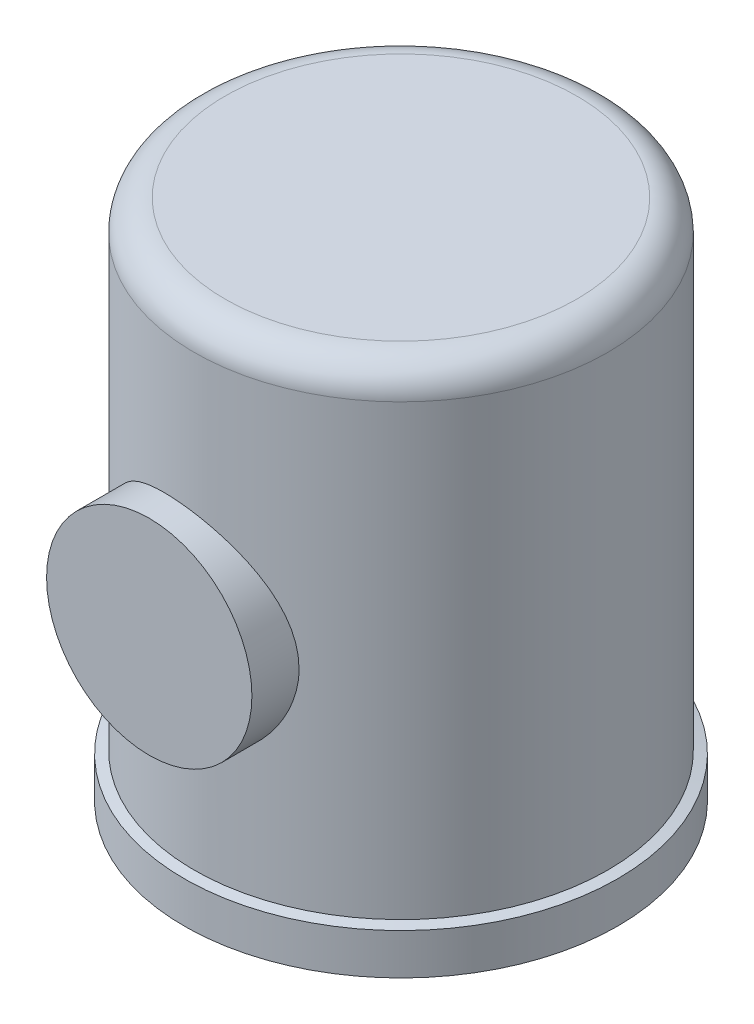
ISO-10303-21;
HEADER;
FILE_DESCRIPTION(('STEP AP214'),'2;1');
FILE_NAME('part.step','',(''),(''),'','','');
FILE_SCHEMA(('AUTOMOTIVE_DESIGN { 1 0 10303 214 1 1 1 1 }'));
ENDSEC;
DATA;
#1=APPLICATION_CONTEXT('core data for automotive mechanical design processes');
#2=APPLICATION_PROTOCOL_DEFINITION('international standard','automotive_design',2000,#1);
#3=PRODUCT_CONTEXT('',#1,'mechanical');
#4=PRODUCT('Part','Part','',(#3));
#5=PRODUCT_RELATED_PRODUCT_CATEGORY('part','',(#4));
#6=PRODUCT_DEFINITION_FORMATION('','',#4);
#7=PRODUCT_DEFINITION_CONTEXT('part definition',#1,'design');
#8=PRODUCT_DEFINITION('design','',#6,#7);
#9=PRODUCT_DEFINITION_SHAPE('','',#8);
#10=(LENGTH_UNIT() NAMED_UNIT(*) SI_UNIT(.MILLI.,.METRE.));
#11=(NAMED_UNIT(*) PLANE_ANGLE_UNIT() SI_UNIT($,.RADIAN.));
#12=(NAMED_UNIT(*) SI_UNIT($,.STERADIAN.) SOLID_ANGLE_UNIT());
#13=UNCERTAINTY_MEASURE_WITH_UNIT(LENGTH_MEASURE(1.E-05),#10,'distance_accuracy_value','');
#14=(GEOMETRIC_REPRESENTATION_CONTEXT(3) GLOBAL_UNCERTAINTY_ASSIGNED_CONTEXT((#13)) GLOBAL_UNIT_ASSIGNED_CONTEXT((#10,
#11,#12)) REPRESENTATION_CONTEXT('',''));
#15=CARTESIAN_POINT('',(0.,0.,0.));
#16=DIRECTION('',(0.,0.,1.));
#17=DIRECTION('',(1.,0.,0.));
#18=AXIS2_PLACEMENT_3D('',#15,#16,#17);
#19=CARTESIAN_POINT('',(2.76491495539491,4.729999792516,0.));
#20=DIRECTION('',(0.,-1.,0.));
#21=DIRECTION('',(1.,0.,0.));
#22=AXIS2_PLACEMENT_3D('',#19,#20,#21);
#23=CYLINDRICAL_SURFACE('',#22,20.1350850446053);
#24=CARTESIAN_POINT('',(-8.18093584541035,20.8897612006018,16.9000000000001));
#25=CARTESIAN_POINT('',(-8.07530784233286,20.6169076546923,16.9684093910414));
#26=CARTESIAN_POINT('',(-7.95826143011212,20.350136155145,17.0428199522178));
#27=CARTESIAN_POINT('',(-7.70277620277622,19.8301799099455,17.2009200857928));
#28=CARTESIAN_POINT('',(-7.56435459368962,19.5769844551371,17.2846021798704));
#29=CARTESIAN_POINT('',(-7.26758846568886,19.0854909306585,17.4585237677568));
#30=CARTESIAN_POINT('',(-7.10927083661877,18.8471733919518,17.5487543429049));
#31=CARTESIAN_POINT('',(-6.77367900963651,18.3859392774143,17.7334023530996));
#32=CARTESIAN_POINT('',(-6.59640063509786,18.1630261126956,17.8278207079281));
#33=CARTESIAN_POINT('',(-6.22445343230987,17.7341321481467,18.0182250556329));
#34=CARTESIAN_POINT('',(-6.02983334221243,17.5281068348404,18.1142060718637));
#35=CARTESIAN_POINT('',(-5.62373445109772,17.1332195626569,18.305808238361));
#36=CARTESIAN_POINT('',(-5.4122557707432,16.9443574809572,18.4014293911981));
#37=CARTESIAN_POINT('',(-4.97315901226983,16.5846171466273,18.5903478760803));
#38=CARTESIAN_POINT('',(-4.74552562923659,16.4137563395148,18.6836428881781));
#39=CARTESIAN_POINT('',(-4.27542191651222,16.091419883849,18.8658108287844));
#40=CARTESIAN_POINT('',(-4.03295886162668,15.9399348413408,18.9546858873475));
#41=CARTESIAN_POINT('',(-3.52500708425442,15.6522434096232,19.1293828609319));
#42=CARTESIAN_POINT('',(-3.25899829818441,15.5168099524001,19.2149700528718));
#43=CARTESIAN_POINT('',(-2.71369410908991,15.2694549310798,19.3774978564945));
#44=CARTESIAN_POINT('',(-2.43439825055208,15.1575341737688,19.4544381714367));
#45=CARTESIAN_POINT('',(-1.86468914673446,14.9587775680229,19.5978214771267));
#46=CARTESIAN_POINT('',(-1.57428627312857,14.8719189345674,19.6642739777197));
#47=CARTESIAN_POINT('',(-0.984444075586677,14.7245506594596,19.7852100741211));
#48=CARTESIAN_POINT('',(-0.685006039035176,14.6640372827567,19.8396953660154));
#49=CARTESIAN_POINT('',(-0.110844222114393,14.5753180410868,19.9305617125401));
#50=CARTESIAN_POINT('',(0.163265120079265,14.5444355142884,19.9682263325918));
#51=CARTESIAN_POINT('',(0.714403215252783,14.5054414349707,20.0323235597978));
#52=CARTESIAN_POINT('',(0.991431763668969,14.497328297396,20.0587569486879));
#53=CARTESIAN_POINT('',(1.54595603999393,14.5042109496734,20.1000763169285));
#54=CARTESIAN_POINT('',(1.82345154690142,14.5191978412573,20.1149667393778));
#55=CARTESIAN_POINT('',(2.37659756904154,14.5722893081941,20.1332416934574));
#56=CARTESIAN_POINT('',(2.65224817179721,14.6103927789138,20.1366267748231));
#57=CARTESIAN_POINT('',(3.17574869936583,14.70514867627,20.1324462641042));
#58=CARTESIAN_POINT('',(3.42394912430404,14.7599219743194,20.125798263234));
#59=CARTESIAN_POINT('',(3.9150994736953,14.8880850435606,20.1037098962858));
#60=CARTESIAN_POINT('',(4.15804929965174,14.9614751636592,20.0882693654159));
#61=CARTESIAN_POINT('',(4.63707989909872,15.1262626118931,20.0492993154275));
#62=CARTESIAN_POINT('',(4.87316078776599,15.2176596378928,20.0257699320258));
#63=CARTESIAN_POINT('',(5.33702153328384,15.4177280521712,19.9714912283489));
#64=CARTESIAN_POINT('',(5.56480103876024,15.5264001706144,19.9407416028704));
#65=CARTESIAN_POINT('',(6.01640737096427,15.7631585793609,19.8721639531533));
#66=CARTESIAN_POINT('',(6.23998988997428,15.8916651418116,19.8341770621977));
#67=CARTESIAN_POINT('',(6.67591347683623,16.1650634787058,19.7528475540714));
#68=CARTESIAN_POINT('',(6.88825073569199,16.3099607535542,19.7095031385646));
#69=CARTESIAN_POINT('',(7.5067314007074,16.7678213431288,19.5733154917595));
#70=CARTESIAN_POINT('',(7.89457640948268,17.1040760910856,19.4742803821297));
#71=CARTESIAN_POINT('',(8.64428188968364,17.8620070022761,19.2618649165235));
#72=CARTESIAN_POINT('',(9.00112955278611,18.2885151422152,19.1479807959494));
#73=CARTESIAN_POINT('',(9.48022032439611,18.9687162429615,18.9830176280469));
#74=CARTESIAN_POINT('',(9.63062258020748,19.2023326102863,18.9289783210431));
#75=CARTESIAN_POINT('',(9.91183912913681,19.6819854346959,18.8246009674059));
#76=CARTESIAN_POINT('',(10.0426511834992,19.9280233070127,18.7742633441326));
#77=CARTESIAN_POINT('',(10.287103702945,20.4382868555187,18.6776903444702));
#78=CARTESIAN_POINT('',(10.4001401558616,20.702832424011,18.6316151396441));
#79=CARTESIAN_POINT('',(10.6032760222318,21.2416485703971,18.5470713225928));
#80=CARTESIAN_POINT('',(10.6933857336615,21.5159147188162,18.5085992969969));
#81=CARTESIAN_POINT('',(10.8497288780311,22.0721473486626,18.4408433522351));
#82=CARTESIAN_POINT('',(10.9159739432483,22.354110006305,18.4115549576225));
#83=CARTESIAN_POINT('',(11.0238430459656,22.9235789677835,18.363421903234));
#84=CARTESIAN_POINT('',(11.0654694413303,23.211084738001,18.3445762433112));
#85=CARTESIAN_POINT('',(11.1213643814997,23.7672760771221,18.3191773524844));
#86=CARTESIAN_POINT('',(11.137462964881,24.0357416112366,18.3118026604497));
#87=CARTESIAN_POINT('',(11.1479728364524,24.5731797629995,18.3069940191555));
#88=CARTESIAN_POINT('',(11.1423852361568,24.8421523539526,18.3095595604144));
#89=CARTESIAN_POINT('',(11.1095914694858,25.3784749096081,18.3245284668051));
#90=CARTESIAN_POINT('',(11.0823868898984,25.6458249919588,18.3369311098472));
#91=CARTESIAN_POINT('',(11.0066797437461,26.1768770017012,18.3710827043385));
#92=CARTESIAN_POINT('',(10.9581772328426,26.4405789386253,18.3928316313615));
#93=CARTESIAN_POINT('',(10.8429576922543,26.9511020545741,18.4437159901738));
#94=CARTESIAN_POINT('',(10.7771230980251,27.1981590077301,18.4724896473537));
#95=CARTESIAN_POINT('',(10.6270450476799,27.6857407426478,18.5368603145595));
#96=CARTESIAN_POINT('',(10.5427952381667,27.9262632376902,18.5724596789875));
#97=CARTESIAN_POINT('',(10.2634458122365,28.6358576456998,18.6878174044232));
#98=CARTESIAN_POINT('',(10.041669199114,29.093293954474,18.7761715199073));
#99=CARTESIAN_POINT('',(9.51535226985977,29.9975748085056,18.9720043918094));
#100=CARTESIAN_POINT('',(9.20616118802674,30.441516389122,19.0803815557358));
#101=CARTESIAN_POINT('',(8.69231563663447,31.0654602756239,19.2437000769331));
#102=CARTESIAN_POINT('',(8.51256990551251,31.2665529473097,19.2982974476691));
#103=CARTESIAN_POINT('',(8.13715914614069,31.6538249506679,19.4061524528647));
#104=CARTESIAN_POINT('',(7.94149196700701,31.8400022606076,19.4594099050335));
#105=CARTESIAN_POINT('',(7.52275238407479,32.2072586159779,19.5661480759746));
#106=CARTESIAN_POINT('',(7.29873401032303,32.3873147633267,19.6194399203278));
#107=CARTESIAN_POINT('',(6.83533491055874,32.727910808636,19.7207897446565));
#108=CARTESIAN_POINT('',(6.59596036410024,32.8884584827543,19.7688498092402));
#109=CARTESIAN_POINT('',(6.10329517828921,33.1887774521509,19.8579837152425));
#110=CARTESIAN_POINT('',(5.85000590601641,33.3285507834635,19.8990582413508));
#111=CARTESIAN_POINT('',(5.33125027614361,33.5860354267319,19.9725855687246));
#112=CARTESIAN_POINT('',(5.06578482471519,33.7037483771527,20.0050390103685));
#113=CARTESIAN_POINT('',(4.53766260527249,33.9108386839948,20.0585655256708));
#114=CARTESIAN_POINT('',(4.27547969502705,34.0013027108354,20.0801090040033));
#115=CARTESIAN_POINT('',(3.74390456456065,34.1602648885666,20.1130336718265));
#116=CARTESIAN_POINT('',(3.47451254141546,34.2287636392595,20.1244151388247));
#117=CARTESIAN_POINT('',(2.9308569408376,34.3430947425977,20.1362359941121));
#118=CARTESIAN_POINT('',(2.65659582072991,34.3889382098955,20.1366807531685));
#119=CARTESIAN_POINT('',(2.10542963420214,34.4576088365553,20.1261690631826));
#120=CARTESIAN_POINT('',(1.82852473075143,34.4804374054835,20.1152133124574));
#121=CARTESIAN_POINT('',(1.2965308403308,34.5021031805338,20.0830968687472));
#122=CARTESIAN_POINT('',(1.04145817367567,34.5027039469037,20.0628170222538));
#123=CARTESIAN_POINT('',(0.532973081523891,34.4845174771381,20.0126295815022));
#124=CARTESIAN_POINT('',(0.279560552746959,34.465731458842,19.9827225920831));
#125=CARTESIAN_POINT('',(-0.223837850706678,34.4091600469359,19.9136525476325));
#126=CARTESIAN_POINT('',(-0.473823852705735,34.3713753612523,19.8744898375156));
#127=CARTESIAN_POINT('',(-0.968763357056348,34.2773731593252,19.7874818546674));
#128=CARTESIAN_POINT('',(-1.21371670506459,34.2211550786535,19.7396363160892));
#129=CARTESIAN_POINT('',(-1.6990953515102,34.0904593886224,19.6355893942516));
#130=CARTESIAN_POINT('',(-1.93946779416698,34.0158373467637,19.5793233721991));
#131=CARTESIAN_POINT('',(-2.41240783553319,33.8493507296399,19.4596122516007));
#132=CARTESIAN_POINT('',(-2.64497263329956,33.7574800428295,19.3961646116357));
#133=CARTESIAN_POINT('',(-3.1011318815468,33.5573478697704,19.2631150228216));
#134=CARTESIAN_POINT('',(-3.32472538274953,33.4490846547378,19.1935124251826));
#135=CARTESIAN_POINT('',(-3.76207666808375,33.2169693901737,19.0492280228991));
#136=CARTESIAN_POINT('',(-3.97583003993785,33.0931104387812,18.9745439762374));
#137=CARTESIAN_POINT('',(-4.41359772014838,32.8174261308166,18.8135674099701));
#138=CARTESIAN_POINT('',(-4.63647934408464,32.6640406957654,18.7268630822426));
#139=CARTESIAN_POINT('',(-5.0683418152653,32.3403969277554,18.5503686522877));
#140=CARTESIAN_POINT('',(-5.27732128923421,32.1701369320257,18.4605782465376));
#141=CARTESIAN_POINT('',(-5.68050942211954,31.8136741613233,18.2796401284087));
#142=CARTESIAN_POINT('',(-5.87472164377145,31.6274752549516,18.1884927497984));
#143=CARTESIAN_POINT('',(-6.24758052401086,31.2400004958486,18.0066565399016));
#144=CARTESIAN_POINT('',(-6.42622646229572,31.0387239462262,17.9159677300173));
#145=CARTESIAN_POINT('',(-6.92632667036771,30.4270873254079,17.6533175279046));
#146=CARTESIAN_POINT('',(-7.2256995395081,29.9966973384719,17.484385773061));
#147=CARTESIAN_POINT('',(-7.6235692279401,29.3154048222201,17.2489147025606));
#148=CARTESIAN_POINT('',(-7.74773632737728,29.0821636125389,17.1733611010828));
#149=CARTESIAN_POINT('',(-7.97808430959972,28.604428312115,17.030204774891));
#150=CARTESIAN_POINT('',(-8.08425292224474,28.3599266880475,16.9626074837679));
#151=CARTESIAN_POINT('',(-8.18093584541043,28.1102387993979,16.9000000000001));
#152=B_SPLINE_CURVE_WITH_KNOTS('',3,(#24,#25,#26,#27,#28,#29,#30,#31,#32,#33,#34,#35,#36,#37,
#38,#39,#40,#41,#42,#43,#44,#45,#46,#47,#48,#49,#50,#51,#52,#53,#54,#55,#56,#57,#58,#59,#60,#61,
#62,#63,#64,#65,#66,#67,#68,#69,#70,#71,#72,#73,#74,#75,#76,#77,#78,#79,#80,#81,#82,#83,#84,#85,
#86,#87,#88,#89,#90,#91,#92,#93,#94,#95,#96,#97,#98,#99,#100,#101,#102,#103,#104,#105,#106,#107,
#108,#109,#110,#111,#112,#113,#114,#115,#116,#117,#118,#119,#120,#121,#122,#123,#124,#125,#126,
#127,#128,#129,#130,#131,#132,#133,#134,#135,#136,#137,#138,#139,#140,#141,#142,#143,#144,#145,
#146,#147,#148,#149,#150,#151),.UNSPECIFIED.,.F.,.F.,(4,2,2,2,2,2,2,2,2,2,2,2,2,2,2,2,2,2,2,2,2,
2,2,2,2,2,2,2,2,2,2,2,2,2,2,2,2,2,2,2,2,2,2,2,2,2,2,2,2,2,2,2,2,2,2,2,2,2,2,2,2,2,2,4),(0.,
0.900888498876488,1.80105556905184,2.70001887297264,3.59918060775548,4.49589052201921,
5.39259401879715,6.29015869240044,7.18728653662181,8.11761619816098,9.04797777669219,
9.97749084029523,10.9068720809396,11.7409492186726,12.5749682919875,13.4086661764895,
14.2423242256072,15.0042177811006,15.7661256166601,16.5280206693552,17.2899479335577,
18.07107828833,18.8524715573122,20.4144697231856,22.1092707391239,22.9576264775194,
23.8060790916005,24.6790004330854,25.5515289906236,26.4236316767437,27.2956508232904,
28.1017579523488,28.9078237653464,29.7138304147839,30.5198349577621,31.2908384908395,
32.062108447371,33.6036162038828,35.2513683003423,36.0762172270674,36.9011777710987,
37.7770259965441,38.6525239520059,39.5279360457367,40.4032830952125,41.2367278403115,
42.0701498247292,42.9031625264938,43.7361242066156,44.5028437851302,45.2695152027735,
46.0361580549072,46.8028243837397,47.575710378643,48.3488707413409,49.122112699715,
49.8956980654193,50.7471456412593,51.5986771998748,52.4500026624917,53.3013674978147,
54.9462160703816,55.7699036595337,56.5941505440372),.UNSPECIFIED.);
#153=CARTESIAN_POINT('',(-8.18093584541035,20.8897612006018,16.9000000000001));
#154=VERTEX_POINT('',#153);
#155=CARTESIAN_POINT('',(-8.18093584541043,28.1102387993979,16.9000000000001));
#156=VERTEX_POINT('',#155);
#157=EDGE_CURVE('E167',#154,#156,#152,.T.);
#158=ORIENTED_EDGE('',*,*,#157,.F.);
#159=DIRECTION('',(0.,-1.,0.));
#160=VECTOR('',#159,1.);
#161=CARTESIAN_POINT('',(-8.18093584541016,4.72999979251587,16.9000000000001));
#162=LINE('',#161,#160);
#163=EDGE_CURVE('E160',#154,#156,#162,.F.);
#164=ORIENTED_EDGE('',*,*,#163,.T.);
#165=EDGE_LOOP('',(#158,#164));
#166=FACE_BOUND('',#165,.T.);
#167=CARTESIAN_POINT('',(2.7649149553944,47.9081781359909,0.));
#168=DIRECTION('',(0.,-1.,0.));
#169=DIRECTION('',(1.,0.,0.));
#170=AXIS2_PLACEMENT_3D('',#167,#168,#169);
#171=CIRCLE('',#170,20.1350850446056);
#172=CARTESIAN_POINT('',(22.9,47.9081781359912,0.));
#173=VERTEX_POINT('',#172);
#174=EDGE_CURVE('E253',#173,#173,#171,.T.);
#175=ORIENTED_EDGE('',*,*,#174,.T.);
#176=EDGE_LOOP('',(#175));
#177=FACE_BOUND('',#176,.T.);
#178=CARTESIAN_POINT('',(2.76491495539492,4.23666284308121,0.));
#179=DIRECTION('',(0.,-1.,0.));
#180=DIRECTION('',(1.,0.,0.));
#181=AXIS2_PLACEMENT_3D('',#178,#179,#180);
#182=CIRCLE('',#181,20.1350850446051);
#183=CARTESIAN_POINT('',(22.9,4.23666284308146,0.));
#184=VERTEX_POINT('',#183);
#185=EDGE_CURVE('E257',#184,#184,#182,.T.);
#186=ORIENTED_EDGE('',*,*,#185,.F.);
#187=EDGE_LOOP('',(#186));
#188=FACE_BOUND('',#187,.T.);
#189=DIRECTION('',(0.,-1.,0.));
#190=VECTOR('',#189,1.);
#191=CARTESIAN_POINT('',(-17.3701700892104,4.72999979251576,0.));
#192=LINE('',#191,#190);
#193=CARTESIAN_POINT('',(-17.3701700892105,10.,0.));
#194=VERTEX_POINT('',#193);
#195=CARTESIAN_POINT('',(-17.3701700892108,40.,0.));
#196=VERTEX_POINT('',#195);
#197=EDGE_CURVE('E125',#194,#196,#192,.F.);
#198=ORIENTED_EDGE('',*,*,#197,.F.);
#199=CARTESIAN_POINT('',(2.76491495539485,10.,0.));
#200=DIRECTION('',(0.,1.,0.));
#201=DIRECTION('',(0.,0.,1.));
#202=AXIS2_PLACEMENT_3D('',#199,#200,#201);
#203=CIRCLE('',#202,20.1350850446053);
#204=CARTESIAN_POINT('',(4.06397761226387,10.,-20.093135294598));
#205=VERTEX_POINT('',#204);
#206=EDGE_CURVE('E11',#194,#205,#203,.F.);
#207=ORIENTED_EDGE('',*,*,#206,.T.);
#208=DIRECTION('',(0.,1.,0.));
#209=VECTOR('',#208,1.);
#210=CARTESIAN_POINT('',(4.06397761226396,25.,-20.0931352945979));
#211=LINE('',#210,#209);
#212=CARTESIAN_POINT('',(4.06397761226404,40.,-20.0931352945979));
#213=VERTEX_POINT('',#212);
#214=EDGE_CURVE('E149',#213,#205,#211,.F.);
#215=ORIENTED_EDGE('',*,*,#214,.F.);
#216=CARTESIAN_POINT('',(2.76491495539449,40.,0.));
#217=DIRECTION('',(0.,1.,0.));
#218=DIRECTION('',(0.,0.,1.));
#219=AXIS2_PLACEMENT_3D('',#216,#217,#218);
#220=CIRCLE('',#219,20.1350850446053);
#221=EDGE_CURVE('E151',#196,#213,#220,.F.);
#222=ORIENTED_EDGE('',*,*,#221,.F.);
#223=EDGE_LOOP('',(#198,#207,#215,#222));
#224=FACE_BOUND('',#223,.T.);
#225=ADVANCED_FACE('F37',(#166,#177,#188,#224),#23,.T.);
#226=CARTESIAN_POINT('',(2.76491495539491,4.729999792516,0.));
#227=DIRECTION('',(0.,-1.,0.));
#228=DIRECTION('',(1.,0.,0.));
#229=AXIS2_PLACEMENT_3D('',#226,#227,#228);
#230=CYLINDRICAL_SURFACE('',#229,18.1350850446051);
#231=DIRECTION('',(0.,1.,0.));
#232=VECTOR('',#231,1.);
#233=CARTESIAN_POINT('',(17.9053328461909,25.,-9.98243736104143));
#234=LINE('',#233,#232);
#235=CARTESIAN_POINT('',(17.90533284619,10.,-9.98243736104319));
#236=VERTEX_POINT('',#235);
#237=CARTESIAN_POINT('',(17.9053328461896,11.9081781359906,-9.98243736104382));
#238=VERTEX_POINT('',#237);
#239=EDGE_CURVE('E147',#236,#238,#234,.T.);
#240=ORIENTED_EDGE('',*,*,#239,.F.);
#241=CARTESIAN_POINT('',(2.76491495539485,10.,0.));
#242=DIRECTION('',(0.,1.,0.));
#243=DIRECTION('',(0.,0.,1.));
#244=AXIS2_PLACEMENT_3D('',#241,#242,#243);
#245=CIRCLE('',#244,18.1350850446051);
#246=CARTESIAN_POINT('',(-15.3701700892102,10.,0.));
#247=VERTEX_POINT('',#246);
#248=EDGE_CURVE('E153',#236,#247,#245,.T.);
#249=ORIENTED_EDGE('',*,*,#248,.T.);
#250=DIRECTION('',(0.,-1.,0.));
#251=VECTOR('',#250,1.);
#252=CARTESIAN_POINT('',(-15.3701700892102,4.72999979251578,0.));
#253=LINE('',#252,#251);
#254=CARTESIAN_POINT('',(-15.3701700892103,11.9081781359909,0.));
#255=VERTEX_POINT('',#254);
#256=EDGE_CURVE('E136',#255,#247,#253,.T.);
#257=ORIENTED_EDGE('',*,*,#256,.F.);
#258=CARTESIAN_POINT('',(2.76491495539483,11.908178135991,0.));
#259=DIRECTION('',(0.,-1.,0.));
#260=DIRECTION('',(1.,0.,0.));
#261=AXIS2_PLACEMENT_3D('',#258,#259,#260);
#262=CIRCLE('',#261,18.1350850446052);
#263=EDGE_CURVE('E176',#238,#255,#262,.T.);
#264=ORIENTED_EDGE('',*,*,#263,.F.);
#265=EDGE_LOOP('',(#240,#249,#257,#264));
#266=FACE_BOUND('',#265,.T.);
#267=CARTESIAN_POINT('',(2.76491495539497,-2.15973072759112E-13,0.));
#268=DIRECTION('',(0.,-1.,0.));
#269=DIRECTION('',(1.,0.,0.));
#270=AXIS2_PLACEMENT_3D('',#267,#268,#269);
#271=CIRCLE('',#270,18.135085044605);
#272=CARTESIAN_POINT('',(20.9,0.,0.));
#273=VERTEX_POINT('',#272);
#274=EDGE_CURVE('E294',#273,#273,#271,.T.);
#275=ORIENTED_EDGE('',*,*,#274,.T.);
#276=EDGE_LOOP('',(#275));
#277=FACE_BOUND('',#276,.T.);
#278=ADVANCED_FACE('F39',(#266,#277),#230,.F.);
#279=CARTESIAN_POINT('',(20.9,0.,0.));
#280=DIRECTION('',(0.,-1.,0.));
#281=DIRECTION('',(1.,0.,0.));
#282=AXIS2_PLACEMENT_3D('',#279,#280,#281);
#283=PLANE('',#282);
#284=CARTESIAN_POINT('',(2.76491495539497,-2.51534904016637E-13,0.));
#285=DIRECTION('',(0.,-1.,0.));
#286=DIRECTION('',(1.,0.,0.));
#287=AXIS2_PLACEMENT_3D('',#284,#285,#286);
#288=CIRCLE('',#287,21.1066768821091);
#289=CARTESIAN_POINT('',(23.8715918375041,0.,0.));
#290=VERTEX_POINT('',#289);
#291=EDGE_CURVE('E291',#290,#290,#288,.T.);
#292=ORIENTED_EDGE('',*,*,#291,.T.);
#293=EDGE_LOOP('',(#292));
#294=FACE_BOUND('',#293,.T.);
#295=ORIENTED_EDGE('',*,*,#274,.F.);
#296=EDGE_LOOP('',(#295));
#297=FACE_BOUND('',#296,.T.);
#298=ADVANCED_FACE('F246',(#294,#297),#283,.T.);
#299=CARTESIAN_POINT('',(2.76491495539491,4.729999792516,0.));
#300=DIRECTION('',(0.,-1.,0.));
#301=DIRECTION('',(1.,0.,0.));
#302=AXIS2_PLACEMENT_3D('',#299,#300,#301);
#303=CYLINDRICAL_SURFACE('',#302,21.1066768821092);
#304=CARTESIAN_POINT('',(2.76491495539492,3.99999999999975,0.));
#305=DIRECTION('',(0.,-1.,0.));
#306=DIRECTION('',(1.,0.,0.));
#307=AXIS2_PLACEMENT_3D('',#304,#305,#306);
#308=CIRCLE('',#307,21.1066768821092);
#309=CARTESIAN_POINT('',(23.8715918375041,4.,0.));
#310=VERTEX_POINT('',#309);
#311=EDGE_CURVE('E288',#310,#310,#308,.T.);
#312=ORIENTED_EDGE('',*,*,#311,.T.);
#313=EDGE_LOOP('',(#312));
#314=FACE_BOUND('',#313,.T.);
#315=ORIENTED_EDGE('',*,*,#291,.F.);
#316=EDGE_LOOP('',(#315));
#317=FACE_BOUND('',#316,.T.);
#318=ADVANCED_FACE('F237',(#314,#317),#303,.T.);
#319=CARTESIAN_POINT('',(2.76491495539492,3.99999999999975,0.));
#320=DIRECTION('',(0.,-1.,0.));
#321=DIRECTION('',(1.,0.,0.));
#322=AXIS2_PLACEMENT_3D('',#319,#320,#321);
#323=CONICAL_SURFACE('',#322,21.1066768821092,1.33186665186767);
#324=ORIENTED_EDGE('',*,*,#185,.T.);
#325=EDGE_LOOP('',(#324));
#326=FACE_BOUND('',#325,.T.);
#327=ORIENTED_EDGE('',*,*,#311,.F.);
#328=EDGE_LOOP('',(#327));
#329=FACE_BOUND('',#328,.T.);
#330=ADVANCED_FACE('F232',(#326,#329),#323,.T.);
#331=CARTESIAN_POINT('',(2.7649149553944,47.908178135991,0.));
#332=DIRECTION('',(0.,-1.,0.));
#333=DIRECTION('',(1.,0.,0.));
#334=AXIS2_PLACEMENT_3D('',#331,#332,#333);
#335=TOROIDAL_SURFACE('',#334,17.1350850446056,3.);
#336=CARTESIAN_POINT('',(2.76491495539437,50.908178135991,0.));
#337=DIRECTION('',(0.,-1.,0.));
#338=DIRECTION('',(1.,0.,0.));
#339=AXIS2_PLACEMENT_3D('',#336,#337,#338);
#340=CIRCLE('',#339,17.1350850446056);
#341=CARTESIAN_POINT('',(19.9,50.9081781359912,0.));
#342=VERTEX_POINT('',#341);
#343=EDGE_CURVE('E284',#342,#342,#340,.T.);
#344=ORIENTED_EDGE('',*,*,#343,.T.);
#345=EDGE_LOOP('',(#344));
#346=FACE_BOUND('',#345,.T.);
#347=ORIENTED_EDGE('',*,*,#174,.F.);
#348=EDGE_LOOP('',(#347));
#349=FACE_BOUND('',#348,.T.);
#350=ADVANCED_FACE('F229',(#346,#349),#335,.T.);
#351=CARTESIAN_POINT('',(19.9,50.9081781359912,0.));
#352=DIRECTION('',(0.,1.,0.));
#353=DIRECTION('',(-1.,0.,0.));
#354=AXIS2_PLACEMENT_3D('',#351,#352,#353);
#355=PLANE('',#354);
#356=ORIENTED_EDGE('',*,*,#343,.F.);
#357=EDGE_LOOP('',(#356));
#358=FACE_BOUND('',#357,.T.);
#359=ADVANCED_FACE('F227',(#358),#355,.T.);
#360=CARTESIAN_POINT('',(20.9,11.9081781359913,0.));
#361=DIRECTION('',(0.,-1.,0.));
#362=DIRECTION('',(1.,0.,0.));
#363=AXIS2_PLACEMENT_3D('',#360,#361,#362);
#364=PLANE('',#363);
#365=CARTESIAN_POINT('',(0.,11.9081781359911,0.));
#366=DIRECTION('',(0.,-1.,0.));
#367=DIRECTION('',(1.,0.,0.));
#368=AXIS2_PLACEMENT_3D('',#365,#366,#367);
#369=CIRCLE('',#368,20.5);
#370=CARTESIAN_POINT('',(20.5,11.9081781359913,0.));
#371=VERTEX_POINT('',#370);
#372=EDGE_CURVE('E145',#238,#371,#369,.T.);
#373=ORIENTED_EDGE('',*,*,#372,.F.);
#374=ORIENTED_EDGE('',*,*,#263,.T.);
#375=DIRECTION('',(-1.,0.,0.));
#376=VECTOR('',#375,1.);
#377=CARTESIAN_POINT('',(20.9,11.9081781359913,0.));
#378=LINE('',#377,#376);
#379=EDGE_CURVE('E134',#371,#255,#378,.T.);
#380=ORIENTED_EDGE('',*,*,#379,.F.);
#381=EDGE_LOOP('',(#373,#374,#380));
#382=FACE_BOUND('',#381,.T.);
#383=ADVANCED_FACE('F192',(#382),#364,.T.);
#384=CARTESIAN_POINT('',(1.14462986457853,24.5,16.9000000000001));
#385=DIRECTION('',(0.,0.,1.));
#386=DIRECTION('',(1.,0.,0.));
#387=AXIS2_PLACEMENT_3D('',#384,#385,#386);
#388=CYLINDRICAL_SURFACE('',#387,10.);
#389=CARTESIAN_POINT('',(1.14462986457853,24.5,22.9000000000001));
#390=DIRECTION('',(0.,0.,1.));
#391=DIRECTION('',(1.,0.,0.));
#392=AXIS2_PLACEMENT_3D('',#389,#390,#391);
#393=CIRCLE('',#392,10.);
#394=CARTESIAN_POINT('',(11.1446298645785,24.5,22.9000000000001));
#395=VERTEX_POINT('',#394);
#396=EDGE_CURVE('E156',#395,#395,#393,.T.);
#397=ORIENTED_EDGE('',*,*,#396,.F.);
#398=EDGE_LOOP('',(#397));
#399=FACE_BOUND('',#398,.T.);
#400=CARTESIAN_POINT('',(1.14462986457853,24.5,16.9000000000001));
#401=DIRECTION('',(0.,0.,1.));
#402=DIRECTION('',(1.,0.,0.));
#403=AXIS2_PLACEMENT_3D('',#400,#401,#402);
#404=CIRCLE('',#403,10.);
#405=EDGE_CURVE('E161',#156,#154,#404,.T.);
#406=ORIENTED_EDGE('',*,*,#405,.T.);
#407=ORIENTED_EDGE('',*,*,#157,.T.);
#408=EDGE_LOOP('',(#406,#407));
#409=FACE_BOUND('',#408,.T.);
#410=ADVANCED_FACE('F189',(#399,#409),#388,.T.);
#411=CARTESIAN_POINT('',(1.14462986457853,24.5,16.9000000000001));
#412=DIRECTION('',(0.,0.,1.));
#413=DIRECTION('',(1.,0.,0.));
#414=AXIS2_PLACEMENT_3D('',#411,#412,#413);
#415=PLANE('',#414);
#416=ORIENTED_EDGE('',*,*,#163,.F.);
#417=ORIENTED_EDGE('',*,*,#405,.F.);
#418=EDGE_LOOP('',(#416,#417));
#419=FACE_BOUND('',#418,.T.);
#420=ADVANCED_FACE('F313',(#419),#415,.F.);
#421=CARTESIAN_POINT('',(1.14462986457853,24.5,22.9000000000001));
#422=DIRECTION('',(0.,0.,1.));
#423=DIRECTION('',(1.,0.,0.));
#424=AXIS2_PLACEMENT_3D('',#421,#422,#423);
#425=PLANE('',#424);
#426=ORIENTED_EDGE('',*,*,#396,.T.);
#427=EDGE_LOOP('',(#426));
#428=FACE_BOUND('',#427,.T.);
#429=ADVANCED_FACE('F190',(#428),#425,.T.);
#430=CARTESIAN_POINT('',(0.,10.,0.));
#431=DIRECTION('',(0.,1.,0.));
#432=DIRECTION('',(0.,0.,1.));
#433=AXIS2_PLACEMENT_3D('',#430,#431,#432);
#434=CYLINDRICAL_SURFACE('',#433,20.5);
#435=ORIENTED_EDGE('',*,*,#214,.T.);
#436=CARTESIAN_POINT('',(0.,10.,0.));
#437=DIRECTION('',(0.,1.,0.));
#438=DIRECTION('',(0.,0.,1.));
#439=AXIS2_PLACEMENT_3D('',#436,#437,#438);
#440=CIRCLE('',#439,20.5);
#441=EDGE_CURVE('E127',#236,#205,#440,.T.);
#442=ORIENTED_EDGE('',*,*,#441,.F.);
#443=ORIENTED_EDGE('',*,*,#239,.T.);
#444=ORIENTED_EDGE('',*,*,#372,.T.);
#445=DIRECTION('',(0.,1.,0.));
#446=VECTOR('',#445,1.);
#447=CARTESIAN_POINT('',(20.5,10.,0.));
#448=LINE('',#447,#446);
#449=CARTESIAN_POINT('',(20.5,13.9081781359911,0.));
#450=VERTEX_POINT('',#449);
#451=EDGE_CURVE('E60',#371,#450,#448,.T.);
#452=ORIENTED_EDGE('',*,*,#451,.T.);
#453=CARTESIAN_POINT('',(0.,13.9081781359911,0.));
#454=DIRECTION('',(0.,1.,0.));
#455=DIRECTION('',(-1.,0.,0.));
#456=AXIS2_PLACEMENT_3D('',#453,#454,#455);
#457=CIRCLE('',#456,20.5);
#458=CARTESIAN_POINT('',(17.9053328461896,13.9081781359906,-9.98243736104387));
#459=VERTEX_POINT('',#458);
#460=EDGE_CURVE('E119',#450,#459,#457,.T.);
#461=ORIENTED_EDGE('',*,*,#460,.T.);
#462=DIRECTION('',(0.,1.,0.));
#463=VECTOR('',#462,1.);
#464=CARTESIAN_POINT('',(17.905332846189,25.,-9.9824373610449));
#465=LINE('',#464,#463);
#466=CARTESIAN_POINT('',(17.90533284619,40.,-9.98243736104315));
#467=VERTEX_POINT('',#466);
#468=EDGE_CURVE('E143',#459,#467,#465,.T.);
#469=ORIENTED_EDGE('',*,*,#468,.T.);
#470=CARTESIAN_POINT('',(0.,40.,0.));
#471=DIRECTION('',(0.,1.,0.));
#472=DIRECTION('',(0.,0.,1.));
#473=AXIS2_PLACEMENT_3D('',#470,#471,#472);
#474=CIRCLE('',#473,20.5);
#475=EDGE_CURVE('E115',#467,#213,#474,.T.);
#476=ORIENTED_EDGE('',*,*,#475,.T.);
#477=EDGE_LOOP('',(#435,#442,#443,#444,#452,#461,#469,#476));
#478=FACE_BOUND('',#477,.T.);
#479=ADVANCED_FACE('F260',(#478),#434,.F.);
#480=CARTESIAN_POINT('',(-20.5,10.,0.));
#481=DIRECTION('',(0.,0.,1.));
#482=DIRECTION('',(1.,0.,0.));
#483=AXIS2_PLACEMENT_3D('',#480,#481,#482);
#484=PLANE('',#483);
#485=ORIENTED_EDGE('',*,*,#197,.T.);
#486=DIRECTION('',(1.,0.,0.));
#487=VECTOR('',#486,1.);
#488=CARTESIAN_POINT('',(-20.5,40.,0.));
#489=LINE('',#488,#487);
#490=CARTESIAN_POINT('',(-15.3701700892109,40.,0.));
#491=VERTEX_POINT('',#490);
#492=EDGE_CURVE('E52',#196,#491,#489,.T.);
#493=ORIENTED_EDGE('',*,*,#492,.T.);
#494=DIRECTION('',(0.,-1.,0.));
#495=VECTOR('',#494,1.);
#496=CARTESIAN_POINT('',(-15.3701700892105,4.72999979251578,0.));
#497=LINE('',#496,#495);
#498=CARTESIAN_POINT('',(-15.3701700892104,13.9081781359908,0.));
#499=VERTEX_POINT('',#498);
#500=EDGE_CURVE('E121',#491,#499,#497,.T.);
#501=ORIENTED_EDGE('',*,*,#500,.T.);
#502=DIRECTION('',(1.,0.,0.));
#503=VECTOR('',#502,1.);
#504=CARTESIAN_POINT('',(20.9,13.9081781359913,0.));
#505=LINE('',#504,#503);
#506=EDGE_CURVE('E305',#499,#450,#505,.T.);
#507=ORIENTED_EDGE('',*,*,#506,.T.);
#508=ORIENTED_EDGE('',*,*,#451,.F.);
#509=ORIENTED_EDGE('',*,*,#379,.T.);
#510=ORIENTED_EDGE('',*,*,#256,.T.);
#511=DIRECTION('',(1.,0.,0.));
#512=VECTOR('',#511,1.);
#513=CARTESIAN_POINT('',(-20.5,10.,0.));
#514=LINE('',#513,#512);
#515=EDGE_CURVE('E138',#194,#247,#514,.T.);
#516=ORIENTED_EDGE('',*,*,#515,.F.);
#517=EDGE_LOOP('',(#485,#493,#501,#507,#508,#509,#510,#516));
#518=FACE_BOUND('',#517,.T.);
#519=ADVANCED_FACE('F120',(#518),#484,.F.);
#520=CARTESIAN_POINT('',(0.,10.,0.));
#521=DIRECTION('',(0.,1.,0.));
#522=DIRECTION('',(0.,0.,1.));
#523=AXIS2_PLACEMENT_3D('',#520,#521,#522);
#524=PLANE('',#523);
#525=ORIENTED_EDGE('',*,*,#441,.T.);
#526=ORIENTED_EDGE('',*,*,#206,.F.);
#527=ORIENTED_EDGE('',*,*,#515,.T.);
#528=ORIENTED_EDGE('',*,*,#248,.F.);
#529=EDGE_LOOP('',(#525,#526,#527,#528));
#530=FACE_BOUND('',#529,.T.);
#531=ADVANCED_FACE('F268',(#530),#524,.T.);
#532=CARTESIAN_POINT('',(0.,40.,0.));
#533=DIRECTION('',(0.,1.,0.));
#534=DIRECTION('',(0.,0.,1.));
#535=AXIS2_PLACEMENT_3D('',#532,#533,#534);
#536=PLANE('',#535);
#537=ORIENTED_EDGE('',*,*,#221,.T.);
#538=ORIENTED_EDGE('',*,*,#475,.F.);
#539=CARTESIAN_POINT('',(2.76491495539449,40.,0.));
#540=DIRECTION('',(0.,1.,0.));
#541=DIRECTION('',(0.,0.,1.));
#542=AXIS2_PLACEMENT_3D('',#539,#540,#541);
#543=CIRCLE('',#542,18.1350850446054);
#544=EDGE_CURVE('E45',#467,#491,#543,.T.);
#545=ORIENTED_EDGE('',*,*,#544,.T.);
#546=ORIENTED_EDGE('',*,*,#492,.F.);
#547=EDGE_LOOP('',(#537,#538,#545,#546));
#548=FACE_BOUND('',#547,.T.);
#549=ADVANCED_FACE('F113',(#548),#536,.F.);
#550=CARTESIAN_POINT('',(2.76491495539491,4.729999792516,0.));
#551=DIRECTION('',(0.,-1.,0.));
#552=DIRECTION('',(1.,0.,0.));
#553=AXIS2_PLACEMENT_3D('',#550,#551,#552);
#554=CYLINDRICAL_SURFACE('',#553,18.1350850446054);
#555=ORIENTED_EDGE('',*,*,#468,.F.);
#556=CARTESIAN_POINT('',(2.76491495539481,13.908178135991,0.));
#557=DIRECTION('',(0.,-1.,0.));
#558=DIRECTION('',(1.,0.,0.));
#559=AXIS2_PLACEMENT_3D('',#556,#557,#558);
#560=CIRCLE('',#559,18.1350850446052);
#561=EDGE_CURVE('E133',#459,#499,#560,.T.);
#562=ORIENTED_EDGE('',*,*,#561,.T.);
#563=ORIENTED_EDGE('',*,*,#500,.F.);
#564=ORIENTED_EDGE('',*,*,#544,.F.);
#565=EDGE_LOOP('',(#555,#562,#563,#564));
#566=FACE_BOUND('',#565,.T.);
#567=CARTESIAN_POINT('',(2.76491495539441,46.908178135991,0.));
#568=DIRECTION('',(0.,-1.,0.));
#569=DIRECTION('',(1.,0.,0.));
#570=AXIS2_PLACEMENT_3D('',#567,#568,#569);
#571=CIRCLE('',#570,18.1350850446056);
#572=CARTESIAN_POINT('',(20.9,46.9081781359912,0.));
#573=VERTEX_POINT('',#572);
#574=EDGE_CURVE('E277',#573,#573,#571,.T.);
#575=ORIENTED_EDGE('',*,*,#574,.F.);
#576=EDGE_LOOP('',(#575));
#577=FACE_BOUND('',#576,.T.);
#578=CARTESIAN_POINT('',(-3.8131782010654,33.1844769090738,16.9000000000001));
#579=CARTESIAN_POINT('',(-3.59263421922005,33.3103946530587,16.9858718916861));
#580=CARTESIAN_POINT('',(-3.36640022049441,33.4283938645025,17.0689314927343));
#581=CARTESIAN_POINT('',(-2.90344436705323,33.6476049535408,17.228195497076));
#582=CARTESIAN_POINT('',(-2.66671612994296,33.7488064325555,17.3043956407881));
#583=CARTESIAN_POINT('',(-2.18317320864217,33.933606453996,17.4488296422466));
#584=CARTESIAN_POINT('',(-1.93632892356106,34.0171481660115,17.5170374755176));
#585=CARTESIAN_POINT('',(-1.43466781797206,34.1651743391956,17.6440279693579));
#586=CARTESIAN_POINT('',(-1.17985258006627,34.2296625571358,17.7028124868725));
#587=CARTESIAN_POINT('',(-0.662759455116072,34.3388743533042,17.810175829426));
#588=CARTESIAN_POINT('',(-0.40045533380689,34.3835161111846,17.8587119802774));
#589=CARTESIAN_POINT('',(0.128727409325637,34.4518397524572,17.9444605744466));
#590=CARTESIAN_POINT('',(0.395606302405668,34.475520388567,17.9816723438257));
#591=CARTESIAN_POINT('',(0.931252092705901,34.501310790983,18.0441554612914));
#592=CARTESIAN_POINT('',(1.20001406272526,34.5034642107756,18.0694508743389));
#593=CARTESIAN_POINT('',(1.73768654970042,34.4860211358458,18.1079744625051));
#594=CARTESIAN_POINT('',(2.00659705363695,34.4664263144403,18.1212035658671));
#595=CARTESIAN_POINT('',(2.52360506752078,34.4076403778423,18.1351934768176));
#596=CARTESIAN_POINT('',(2.77184843829315,34.36990818998,18.1367580438014));
#597=CARTESIAN_POINT('',(3.26464776577122,34.2759111821295,18.1298730041474));
#598=CARTESIAN_POINT('',(3.50920388293502,34.2196471710385,18.1214238345583));
#599=CARTESIAN_POINT('',(3.99305656219974,34.0890198871478,18.0950745624804));
#600=CARTESIAN_POINT('',(4.23234994299995,34.0146459780143,18.0771688987381));
#601=CARTESIAN_POINT('',(4.70396336802307,33.8484576552699,18.0326789151862));
#602=CARTESIAN_POINT('',(4.93628328768569,33.7566429303447,18.006094440456));
#603=CARTESIAN_POINT('',(5.39354714532958,33.5558998738096,17.9450562273118));
#604=CARTESIAN_POINT('',(5.61845461983359,33.4468988668297,17.9105687753715));
#605=CARTESIAN_POINT('',(6.05868686808218,33.2128767858136,17.8348616835208));
#606=CARTESIAN_POINT('',(6.27400792139335,33.0878495638725,17.7936394583718));
#607=CARTESIAN_POINT('',(6.69392360516347,32.8226787741962,17.7056546569598));
#608=CARTESIAN_POINT('',(6.89851893909929,32.6825361996924,17.65889244471));
#609=CARTESIAN_POINT('',(7.29610791050712,32.3880031116889,17.5610810410341));
#610=CARTESIAN_POINT('',(7.4890985421198,32.2336089327567,17.5100307470431));
#611=CARTESIAN_POINT('',(7.9916964307601,31.8000942933861,17.3686349686949));
#612=CARTESIAN_POINT('',(8.28989740517526,31.5084132264078,17.2754785411476));
#613=CARTESIAN_POINT('',(8.70755243980365,31.0456383983464,17.1344100486264));
#614=CARTESIAN_POINT('',(8.84173288338365,30.8873098519904,17.0872037297312));
#615=CARTESIAN_POINT('',(9.10000031369988,30.5625927330128,16.9931409741648));
#616=CARTESIAN_POINT('',(9.22408979573226,30.3962061693172,16.946284453614));
#617=CARTESIAN_POINT('',(9.34300811185459,30.2259579211334,16.9000000000001));
#618=B_SPLINE_CURVE_WITH_KNOTS('',3,(#578,#579,#580,#581,#582,#583,#584,#585,#586,#587,#588,
#589,#590,#591,#592,#593,#594,#595,#596,#597,#598,#599,#600,#601,#602,#603,#604,#605,#606,#607,
#608,#609,#610,#611,#612,#613,#614,#615,#616,#617),.UNSPECIFIED.,.F.,.F.,(4,2,2,2,2,2,2,2,2,2,2,
2,2,2,2,2,2,2,2,4),(0.,0.804151823422103,1.60879961256796,2.41599867052294,3.22303846691494,
4.03337524619301,4.84376024096052,5.65250158039086,6.46118069930006,7.21357195400311,
7.96593037186529,8.71873173640882,9.47154653953304,10.2276346356336,10.9840136517935,
11.7403429964547,12.4968674096753,13.7753376445463,14.4135385154971,15.051581088987),.UNSPECIFIED.);
#619=CARTESIAN_POINT('',(-3.8131782010654,33.1844769090738,16.9000000000001));
#620=VERTEX_POINT('',#619);
#621=CARTESIAN_POINT('',(9.34300811185459,30.2259579211334,16.9000000000001));
#622=VERTEX_POINT('',#621);
#623=EDGE_CURVE('E205',#620,#622,#618,.T.);
#624=ORIENTED_EDGE('',*,*,#623,.F.);
#625=DIRECTION('',(0.,-1.,0.));
#626=VECTOR('',#625,1.);
#627=CARTESIAN_POINT('',(-3.81317820106506,4.72999979251592,16.9000000000001));
#628=LINE('',#627,#626);
#629=CARTESIAN_POINT('',(-3.81317820106519,15.815523090926,16.9000000000001));
#630=VERTEX_POINT('',#629);
#631=EDGE_CURVE('E212',#620,#630,#628,.T.);
#632=ORIENTED_EDGE('',*,*,#631,.T.);
#633=CARTESIAN_POINT('',(9.34300811185472,18.7740420788667,16.9000000000001));
#634=CARTESIAN_POINT('',(9.1828057887774,18.5446627579821,16.9623637367547));
#635=CARTESIAN_POINT('',(9.01311233968551,18.3222065732806,17.0257855335689));
#636=CARTESIAN_POINT('',(8.65567716288205,17.8922522199557,17.1527296229265));
#637=CARTESIAN_POINT('',(8.46793187754988,17.6847570139706,17.2162519328426));
#638=CARTESIAN_POINT('',(8.07459914820726,17.2851232926263,17.3416075673942));
#639=CARTESIAN_POINT('',(7.86894277263027,17.0930501147616,17.4034330434031));
#640=CARTESIAN_POINT('',(7.44150709713213,16.7264160565697,17.5231286470934));
#641=CARTESIAN_POINT('',(7.21972876743744,16.55185412391,17.5809990123891));
#642=CARTESIAN_POINT('',(6.76068125407286,16.2211003886542,17.6909861084065));
#643=CARTESIAN_POINT('',(6.52337679205349,16.0649528522113,17.7430889569477));
#644=CARTESIAN_POINT('',(6.03517001179608,15.7728286728752,17.8395244538986));
#645=CARTESIAN_POINT('',(5.78426904470719,15.6368500307038,17.8838578725464));
#646=CARTESIAN_POINT('',(5.2710001521425,15.3865797090428,17.9629656864481));
#647=CARTESIAN_POINT('',(5.00865452616238,15.2722479864469,17.997757786075));
#648=CARTESIAN_POINT('',(4.47404806817897,15.0661770599305,18.0563686886376));
#649=CARTESIAN_POINT('',(4.20178817107856,14.9744357320655,18.0801885233672));
#650=CARTESIAN_POINT('',(3.66850006086091,14.8200310970255,18.114394604563));
#651=CARTESIAN_POINT('',(3.40797392861005,14.7558102711532,18.1255869117537));
#652=CARTESIAN_POINT('',(2.88236567548749,14.6484922460977,18.136609151203));
#653=CARTESIAN_POINT('',(2.61728374178096,14.6053941812689,18.1364395491305));
#654=CARTESIAN_POINT('',(2.08480401016913,14.5406827571969,18.1242841236203));
#655=CARTESIAN_POINT('',(1.81740643478723,14.5190673561705,18.112299423344));
#656=CARTESIAN_POINT('',(1.28255178547232,14.4973701997246,18.0763861271031));
#657=CARTESIAN_POINT('',(1.01509471568603,14.4972872442101,18.0524581968601));
#658=CARTESIAN_POINT('',(0.502495045238024,14.5175950846873,17.9951155502892));
#659=CARTESIAN_POINT('',(0.257193301766378,14.5364394229744,17.9625542257337));
#660=CARTESIAN_POINT('',(-0.229908828805364,14.5918855610443,17.8877907099176));
#661=CARTESIAN_POINT('',(-0.471709118231057,14.628487855213,17.8455882502627));
#662=CARTESIAN_POINT('',(-0.950369485792981,14.7188795531473,17.7521112021889));
#663=CARTESIAN_POINT('',(-1.18722788292843,14.7726747067665,17.7008335813036));
#664=CARTESIAN_POINT('',(-1.6545268254224,14.8967099167348,17.5899840523737));
#665=CARTESIAN_POINT('',(-1.88496840297184,14.9669473109337,17.5304134876653));
#666=CARTESIAN_POINT('',(-2.41003966119162,15.1477907226567,17.3838138244839));
#667=CARTESIAN_POINT('',(-2.70196034348152,15.2641405119872,17.2940539903668));
#668=CARTESIAN_POINT('',(-3.12796979962076,15.4573701638251,17.1516068490021));
#669=CARTESIAN_POINT('',(-3.26780381234977,15.524788395878,17.1028980572667));
#670=CARTESIAN_POINT('',(-3.54349892085013,15.6656702602253,17.0031378215933));
#671=CARTESIAN_POINT('',(-3.6793607890142,15.7391327064682,16.9520868381275));
#672=CARTESIAN_POINT('',(-3.81317820106519,15.815523090926,16.9000000000001));
#673=B_SPLINE_CURVE_WITH_KNOTS('',3,(#633,#634,#635,#636,#637,#638,#639,#640,#641,#642,#643,
#644,#645,#646,#647,#648,#649,#650,#651,#652,#653,#654,#655,#656,#657,#658,#659,#660,#661,#662,
#663,#664,#665,#666,#667,#668,#669,#670,#671,#672),.UNSPECIFIED.,.F.,.F.,(4,2,2,2,2,2,2,2,2,2,2,
2,2,2,2,2,2,2,2,4),(0.,0.85970722221898,1.71958422249453,2.58293057259117,3.44622500905907,
4.31155413996459,5.17679743614414,6.04042419853537,6.90396973187191,7.70856364349057,
8.51312457876586,9.31760903860684,10.122048661086,10.8657073945606,11.6093868328731,
12.3533152425835,13.0971232866398,14.0758053005575,14.5637598427571,15.0516188613312),.UNSPECIFIED.);
#674=CARTESIAN_POINT('',(9.34300811185472,18.7740420788667,16.9000000000001));
#675=VERTEX_POINT('',#674);
#676=EDGE_CURVE('E197',#675,#630,#673,.T.);
#677=ORIENTED_EDGE('',*,*,#676,.F.);
#678=DIRECTION('',(0.,-1.,0.));
#679=VECTOR('',#678,1.);
#680=CARTESIAN_POINT('',(9.34300811185489,4.72999979251607,16.9000000000001));
#681=LINE('',#680,#679);
#682=EDGE_CURVE('E296',#675,#622,#681,.F.);
#683=ORIENTED_EDGE('',*,*,#682,.T.);
#684=EDGE_LOOP('',(#624,#632,#677,#683));
#685=FACE_BOUND('',#684,.T.);
#686=ADVANCED_FACE('F130',(#566,#577,#685),#554,.F.);
#687=CARTESIAN_POINT('',(18.9,48.9081781359912,0.));
#688=DIRECTION('',(0.,-1.,0.));
#689=DIRECTION('',(1.,0.,0.));
#690=AXIS2_PLACEMENT_3D('',#687,#688,#689);
#691=PLANE('',#690);
#692=CARTESIAN_POINT('',(2.76491495539439,48.9081781359911,0.));
#693=DIRECTION('',(0.,-1.,0.));
#694=DIRECTION('',(1.,0.,0.));
#695=AXIS2_PLACEMENT_3D('',#692,#693,#694);
#696=CIRCLE('',#695,16.1350850446056);
#697=CARTESIAN_POINT('',(18.9,48.9081781359912,0.));
#698=VERTEX_POINT('',#697);
#699=EDGE_CURVE('E279',#698,#698,#696,.T.);
#700=ORIENTED_EDGE('',*,*,#699,.T.);
#701=EDGE_LOOP('',(#700));
#702=FACE_BOUND('',#701,.T.);
#703=ADVANCED_FACE('F217',(#702),#691,.T.);
#704=CARTESIAN_POINT('',(2.76491495539441,46.908178135991,0.));
#705=DIRECTION('',(0.,-1.,0.));
#706=DIRECTION('',(1.,0.,0.));
#707=AXIS2_PLACEMENT_3D('',#704,#705,#706);
#708=TOROIDAL_SURFACE('',#707,16.1350850446056,2.00000000000001);
#709=ORIENTED_EDGE('',*,*,#574,.T.);
#710=EDGE_LOOP('',(#709));
#711=FACE_BOUND('',#710,.T.);
#712=ORIENTED_EDGE('',*,*,#699,.F.);
#713=EDGE_LOOP('',(#712));
#714=FACE_BOUND('',#713,.T.);
#715=ADVANCED_FACE('F219',(#711,#714),#708,.F.);
#716=CARTESIAN_POINT('',(20.9,13.9081781359913,0.));
#717=DIRECTION('',(0.,1.,0.));
#718=DIRECTION('',(-1.,0.,0.));
#719=AXIS2_PLACEMENT_3D('',#716,#717,#718);
#720=PLANE('',#719);
#721=ORIENTED_EDGE('',*,*,#460,.F.);
#722=ORIENTED_EDGE('',*,*,#506,.F.);
#723=ORIENTED_EDGE('',*,*,#561,.F.);
#724=EDGE_LOOP('',(#721,#722,#723));
#725=FACE_BOUND('',#724,.T.);
#726=ADVANCED_FACE('F218',(#725),#720,.T.);
#727=ORIENTED_EDGE('',*,*,#631,.F.);
#728=EDGE_CURVE('E157',#622,#620,#404,.T.);
#729=ORIENTED_EDGE('',*,*,#728,.F.);
#730=ORIENTED_EDGE('',*,*,#682,.F.);
#731=EDGE_CURVE('E162',#630,#675,#404,.T.);
#732=ORIENTED_EDGE('',*,*,#731,.F.);
#733=EDGE_LOOP('',(#727,#729,#730,#732));
#734=FACE_BOUND('',#733,.T.);
#735=ADVANCED_FACE('F187',(#734),#415,.F.);
#736=ORIENTED_EDGE('',*,*,#731,.T.);
#737=ORIENTED_EDGE('',*,*,#676,.T.);
#738=EDGE_LOOP('',(#736,#737));
#739=FACE_BOUND('',#738,.T.);
#740=ADVANCED_FACE('F181',(#739),#388,.T.);
#741=ORIENTED_EDGE('',*,*,#728,.T.);
#742=ORIENTED_EDGE('',*,*,#623,.T.);
#743=EDGE_LOOP('',(#741,#742));
#744=FACE_BOUND('',#743,.T.);
#745=ADVANCED_FACE('F186',(#744),#388,.T.);
#746=CLOSED_SHELL('',(#225,#278,#298,#318,#330,#350,#359,#383,#410,#420,#429,#479,#519,#531,
#549,#686,#703,#715,#726,#735,#740,#745));
#747=MANIFOLD_SOLID_BREP('B2',#746);
#748=ADVANCED_BREP_SHAPE_REPRESENTATION('',(#18,#747),#14);
#749=SHAPE_DEFINITION_REPRESENTATION(#9,#748);
ENDSEC;
END-ISO-10303-21;
